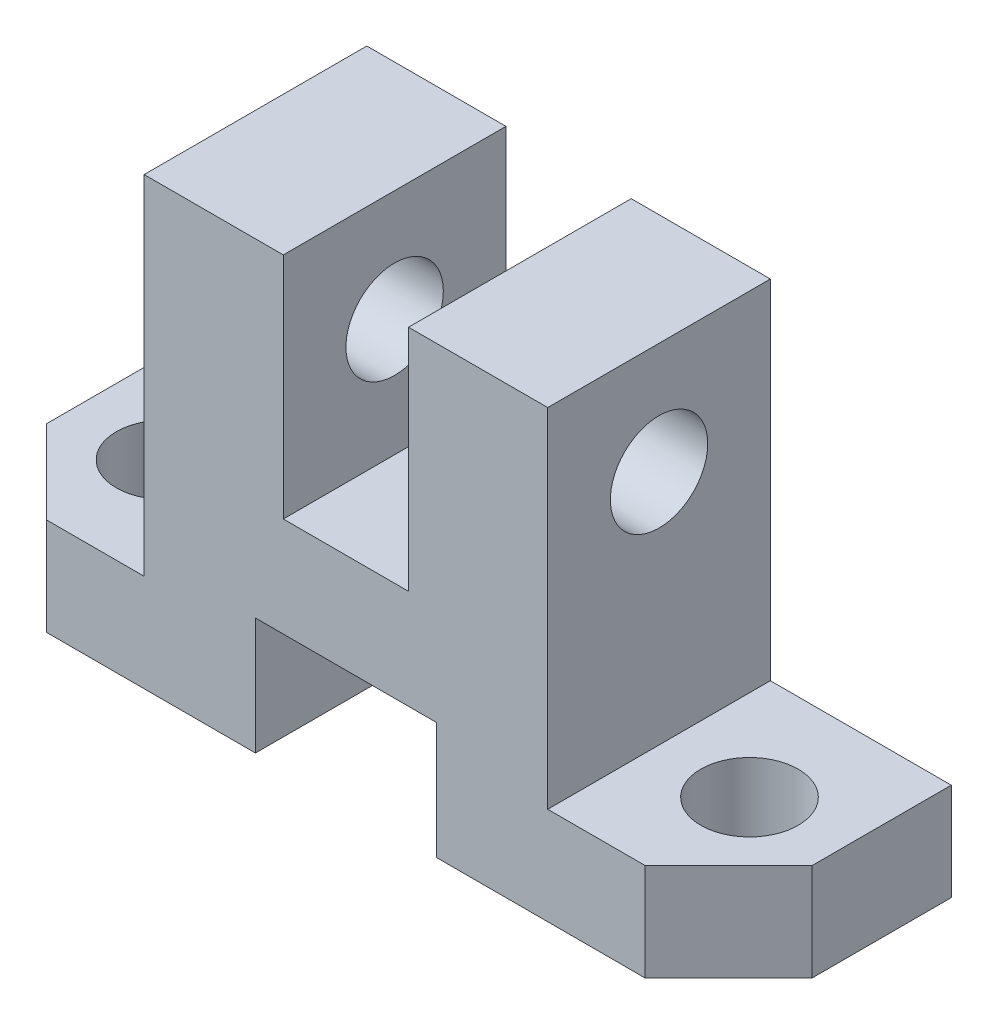
ISO-10303-21;
HEADER;
FILE_DESCRIPTION(('STEP AP214'),'2;1');
FILE_NAME('part.step','',(''),(''),'','','');
FILE_SCHEMA(('AUTOMOTIVE_DESIGN { 1 0 10303 214 1 1 1 1 }'));
ENDSEC;
DATA;
#1=APPLICATION_CONTEXT('core data for automotive mechanical design processes');
#2=APPLICATION_PROTOCOL_DEFINITION('international standard','automotive_design',2000,#1);
#3=PRODUCT_CONTEXT('',#1,'mechanical');
#4=PRODUCT('Part','Part','',(#3));
#5=PRODUCT_RELATED_PRODUCT_CATEGORY('part','',(#4));
#6=PRODUCT_DEFINITION_FORMATION('','',#4);
#7=PRODUCT_DEFINITION_CONTEXT('part definition',#1,'design');
#8=PRODUCT_DEFINITION('design','',#6,#7);
#9=PRODUCT_DEFINITION_SHAPE('','',#8);
#10=(LENGTH_UNIT() NAMED_UNIT(*) SI_UNIT(.MILLI.,.METRE.));
#11=(NAMED_UNIT(*) PLANE_ANGLE_UNIT() SI_UNIT($,.RADIAN.));
#12=(NAMED_UNIT(*) SI_UNIT($,.STERADIAN.) SOLID_ANGLE_UNIT());
#13=UNCERTAINTY_MEASURE_WITH_UNIT(LENGTH_MEASURE(1.E-05),#10,'distance_accuracy_value','');
#14=(GEOMETRIC_REPRESENTATION_CONTEXT(3) GLOBAL_UNCERTAINTY_ASSIGNED_CONTEXT((#13)) GLOBAL_UNIT_ASSIGNED_CONTEXT((#10,
#11,#12)) REPRESENTATION_CONTEXT('',''));
#15=CARTESIAN_POINT('',(0.,0.,0.));
#16=DIRECTION('',(0.,0.,1.));
#17=DIRECTION('',(1.,0.,0.));
#18=AXIS2_PLACEMENT_3D('',#15,#16,#17);
#19=CARTESIAN_POINT('',(-21.5,0.,8.));
#20=DIRECTION('',(0.707106781186547,0.,-0.707106781186548));
#21=DIRECTION('',(0.,-1.,0.));
#22=AXIS2_PLACEMENT_3D('',#19,#20,#21);
#23=PLANE('',#22);
#24=DIRECTION('',(0.,-1.,0.));
#25=VECTOR('',#24,1.);
#26=CARTESIAN_POINT('',(-21.5,0.,8.));
#27=LINE('',#26,#25);
#28=CARTESIAN_POINT('',(-21.5,-1.4046692607004,8.));
#29=VERTEX_POINT('',#28);
#30=CARTESIAN_POINT('',(-21.5,-8.40466926070039,8.));
#31=VERTEX_POINT('',#30);
#32=EDGE_CURVE('E203',#29,#31,#27,.T.);
#33=ORIENTED_EDGE('',*,*,#32,.F.);
#34=DIRECTION('',(-0.707106781186548,0.,-0.707106781186547));
#35=VECTOR('',#34,1.);
#36=CARTESIAN_POINT('',(-21.5,-1.4046692607004,8.));
#37=LINE('',#36,#35);
#38=CARTESIAN_POINT('',(-27.5,-1.4046692607004,2.));
#39=VERTEX_POINT('',#38);
#40=EDGE_CURVE('E47',#39,#29,#37,.F.);
#41=ORIENTED_EDGE('',*,*,#40,.F.);
#42=DIRECTION('',(0.,1.,0.));
#43=VECTOR('',#42,1.);
#44=CARTESIAN_POINT('',(-27.5,-1.4046692607004,2.));
#45=LINE('',#44,#43);
#46=CARTESIAN_POINT('',(-27.5,-8.4046692607004,2.));
#47=VERTEX_POINT('',#46);
#48=EDGE_CURVE('E205',#47,#39,#45,.T.);
#49=ORIENTED_EDGE('',*,*,#48,.F.);
#50=DIRECTION('',(0.707106781186548,0.,0.707106781186547));
#51=VECTOR('',#50,1.);
#52=CARTESIAN_POINT('',(-21.5,-8.40466926070039,8.));
#53=LINE('',#52,#51);
#54=EDGE_CURVE('E13',#31,#47,#53,.F.);
#55=ORIENTED_EDGE('',*,*,#54,.F.);
#56=EDGE_LOOP('',(#33,#41,#49,#55));
#57=FACE_BOUND('',#56,.T.);
#58=ADVANCED_FACE('F39',(#57),#23,.F.);
#59=CARTESIAN_POINT('',(27.5,-1.4046692607004,2.));
#60=DIRECTION('',(-0.707106781186547,0.,-0.707106781186547));
#61=DIRECTION('',(0.,-1.,0.));
#62=AXIS2_PLACEMENT_3D('',#59,#60,#61);
#63=PLANE('',#62);
#64=DIRECTION('',(0.,-1.,0.));
#65=VECTOR('',#64,1.);
#66=CARTESIAN_POINT('',(27.5,-1.4046692607004,2.));
#67=LINE('',#66,#65);
#68=CARTESIAN_POINT('',(27.5,-1.4046692607004,2.));
#69=VERTEX_POINT('',#68);
#70=CARTESIAN_POINT('',(27.5,-8.4046692607004,2.));
#71=VERTEX_POINT('',#70);
#72=EDGE_CURVE('E188',#69,#71,#67,.T.);
#73=ORIENTED_EDGE('',*,*,#72,.F.);
#74=DIRECTION('',(-0.707106781186548,0.,0.707106781186548));
#75=VECTOR('',#74,1.);
#76=CARTESIAN_POINT('',(27.5,-1.4046692607004,2.));
#77=LINE('',#76,#75);
#78=CARTESIAN_POINT('',(21.5,-1.4046692607004,8.));
#79=VERTEX_POINT('',#78);
#80=EDGE_CURVE('E199',#79,#69,#77,.F.);
#81=ORIENTED_EDGE('',*,*,#80,.F.);
#82=DIRECTION('',(0.,1.,0.));
#83=VECTOR('',#82,1.);
#84=CARTESIAN_POINT('',(21.5,0.,8.));
#85=LINE('',#84,#83);
#86=CARTESIAN_POINT('',(21.5,-8.40466926070039,8.));
#87=VERTEX_POINT('',#86);
#88=EDGE_CURVE('E191',#87,#79,#85,.T.);
#89=ORIENTED_EDGE('',*,*,#88,.F.);
#90=DIRECTION('',(0.707106781186548,0.,-0.707106781186548));
#91=VECTOR('',#90,1.);
#92=CARTESIAN_POINT('',(27.5,-8.4046692607004,2.));
#93=LINE('',#92,#91);
#94=EDGE_CURVE('E201',#71,#87,#93,.F.);
#95=ORIENTED_EDGE('',*,*,#94,.F.);
#96=EDGE_LOOP('',(#73,#81,#89,#95));
#97=FACE_BOUND('',#96,.T.);
#98=ADVANCED_FACE('F338',(#97),#63,.F.);
#99=CARTESIAN_POINT('',(-6.5,-8.40466926070039,8.));
#100=DIRECTION('',(-1.,0.,0.));
#101=DIRECTION('',(0.,-1.,0.));
#102=AXIS2_PLACEMENT_3D('',#99,#100,#101);
#103=PLANE('',#102);
#104=DIRECTION('',(0.,1.,0.));
#105=VECTOR('',#104,1.);
#106=CARTESIAN_POINT('',(-6.5,-8.40466926070039,-8.));
#107=LINE('',#106,#105);
#108=CARTESIAN_POINT('',(-6.5,-8.40466926070039,-8.));
#109=VERTEX_POINT('',#108);
#110=CARTESIAN_POINT('',(-6.5,0.,-8.));
#111=VERTEX_POINT('',#110);
#112=EDGE_CURVE('E187',#109,#111,#107,.T.);
#113=ORIENTED_EDGE('',*,*,#112,.T.);
#114=DIRECTION('',(0.,0.,-1.));
#115=VECTOR('',#114,1.);
#116=CARTESIAN_POINT('',(-6.5,0.,8.));
#117=LINE('',#116,#115);
#118=CARTESIAN_POINT('',(-6.5,0.,8.));
#119=VERTEX_POINT('',#118);
#120=EDGE_CURVE('E166',#119,#111,#117,.T.);
#121=ORIENTED_EDGE('',*,*,#120,.F.);
#122=DIRECTION('',(0.,1.,0.));
#123=VECTOR('',#122,1.);
#124=CARTESIAN_POINT('',(-6.5,-8.40466926070039,8.));
#125=LINE('',#124,#123);
#126=CARTESIAN_POINT('',(-6.5,-8.40466926070039,8.));
#127=VERTEX_POINT('',#126);
#128=EDGE_CURVE('E173',#127,#119,#125,.T.);
#129=ORIENTED_EDGE('',*,*,#128,.F.);
#130=DIRECTION('',(0.,0.,-1.));
#131=VECTOR('',#130,1.);
#132=CARTESIAN_POINT('',(-6.5,-8.40466926070039,8.));
#133=LINE('',#132,#131);
#134=EDGE_CURVE('E251',#127,#109,#133,.T.);
#135=ORIENTED_EDGE('',*,*,#134,.T.);
#136=EDGE_LOOP('',(#113,#121,#129,#135));
#137=FACE_BOUND('',#136,.T.);
#138=ADVANCED_FACE('F185',(#137),#103,.F.);
#139=CARTESIAN_POINT('',(-6.5,0.,8.));
#140=DIRECTION('',(0.,1.,0.));
#141=DIRECTION('',(0.,0.,1.));
#142=AXIS2_PLACEMENT_3D('',#139,#140,#141);
#143=PLANE('',#142);
#144=DIRECTION('',(1.,0.,0.));
#145=VECTOR('',#144,1.);
#146=CARTESIAN_POINT('',(-6.5,0.,-8.));
#147=LINE('',#146,#145);
#148=CARTESIAN_POINT('',(6.5,0.,-8.));
#149=VERTEX_POINT('',#148);
#150=EDGE_CURVE('E253',#111,#149,#147,.T.);
#151=ORIENTED_EDGE('',*,*,#150,.T.);
#152=DIRECTION('',(0.,0.,-1.));
#153=VECTOR('',#152,1.);
#154=CARTESIAN_POINT('',(6.5,0.,8.));
#155=LINE('',#154,#153);
#156=CARTESIAN_POINT('',(6.5,0.,8.));
#157=VERTEX_POINT('',#156);
#158=EDGE_CURVE('E169',#157,#149,#155,.T.);
#159=ORIENTED_EDGE('',*,*,#158,.F.);
#160=DIRECTION('',(1.,0.,0.));
#161=VECTOR('',#160,1.);
#162=CARTESIAN_POINT('',(-6.5,0.,8.));
#163=LINE('',#162,#161);
#164=EDGE_CURVE('E162',#119,#157,#163,.T.);
#165=ORIENTED_EDGE('',*,*,#164,.F.);
#166=ORIENTED_EDGE('',*,*,#120,.T.);
#167=EDGE_LOOP('',(#151,#159,#165,#166));
#168=FACE_BOUND('',#167,.T.);
#169=ADVANCED_FACE('F164',(#168),#143,.F.);
#170=CARTESIAN_POINT('',(6.5,0.,8.));
#171=DIRECTION('',(1.,0.,0.));
#172=DIRECTION('',(0.,1.,0.));
#173=AXIS2_PLACEMENT_3D('',#170,#171,#172);
#174=PLANE('',#173);
#175=DIRECTION('',(0.,-1.,0.));
#176=VECTOR('',#175,1.);
#177=CARTESIAN_POINT('',(6.5,0.,-8.));
#178=LINE('',#177,#176);
#179=CARTESIAN_POINT('',(6.5,-8.40466926070039,-8.));
#180=VERTEX_POINT('',#179);
#181=EDGE_CURVE('E255',#149,#180,#178,.T.);
#182=ORIENTED_EDGE('',*,*,#181,.T.);
#183=DIRECTION('',(0.,0.,-1.));
#184=VECTOR('',#183,1.);
#185=CARTESIAN_POINT('',(6.5,-8.40466926070039,8.));
#186=LINE('',#185,#184);
#187=CARTESIAN_POINT('',(6.5,-8.40466926070039,8.));
#188=VERTEX_POINT('',#187);
#189=EDGE_CURVE('E193',#188,#180,#186,.T.);
#190=ORIENTED_EDGE('',*,*,#189,.F.);
#191=DIRECTION('',(0.,-1.,0.));
#192=VECTOR('',#191,1.);
#193=CARTESIAN_POINT('',(6.5,0.,8.));
#194=LINE('',#193,#192);
#195=EDGE_CURVE('E172',#157,#188,#194,.T.);
#196=ORIENTED_EDGE('',*,*,#195,.F.);
#197=ORIENTED_EDGE('',*,*,#158,.T.);
#198=EDGE_LOOP('',(#182,#190,#196,#197));
#199=FACE_BOUND('',#198,.T.);
#200=ADVANCED_FACE('F340',(#199),#174,.F.);
#201=CARTESIAN_POINT('',(6.5,-8.40466926070039,8.));
#202=DIRECTION('',(0.,1.,0.));
#203=DIRECTION('',(-1.,0.,0.));
#204=AXIS2_PLACEMENT_3D('',#201,#202,#203);
#205=PLANE('',#204);
#206=CARTESIAN_POINT('',(21.,-8.40466926070039,0.));
#207=DIRECTION('',(0.,1.,0.));
#208=DIRECTION('',(-1.,0.,0.));
#209=AXIS2_PLACEMENT_3D('',#206,#207,#208);
#210=CIRCLE('',#209,3.5);
#211=CARTESIAN_POINT('',(17.5,-8.40466926070039,0.));
#212=VERTEX_POINT('',#211);
#213=EDGE_CURVE('E214',#212,#212,#210,.T.);
#214=ORIENTED_EDGE('',*,*,#213,.T.);
#215=EDGE_LOOP('',(#214));
#216=FACE_BOUND('',#215,.T.);
#217=DIRECTION('',(0.,0.,-1.));
#218=VECTOR('',#217,1.);
#219=CARTESIAN_POINT('',(27.5,-8.4046692607004,8.));
#220=LINE('',#219,#218);
#221=CARTESIAN_POINT('',(27.5,-8.4046692607004,-8.));
#222=VERTEX_POINT('',#221);
#223=EDGE_CURVE('E317',#71,#222,#220,.T.);
#224=ORIENTED_EDGE('',*,*,#223,.F.);
#225=ORIENTED_EDGE('',*,*,#94,.T.);
#226=DIRECTION('',(1.,0.,0.));
#227=VECTOR('',#226,1.);
#228=CARTESIAN_POINT('',(6.5,-8.40466926070039,8.));
#229=LINE('',#228,#227);
#230=EDGE_CURVE('E229',#188,#87,#229,.T.);
#231=ORIENTED_EDGE('',*,*,#230,.F.);
#232=ORIENTED_EDGE('',*,*,#189,.T.);
#233=DIRECTION('',(1.,0.,0.));
#234=VECTOR('',#233,1.);
#235=CARTESIAN_POINT('',(6.5,-8.40466926070039,-8.));
#236=LINE('',#235,#234);
#237=EDGE_CURVE('E257',#180,#222,#236,.T.);
#238=ORIENTED_EDGE('',*,*,#237,.T.);
#239=EDGE_LOOP('',(#224,#225,#231,#232,#238));
#240=FACE_BOUND('',#239,.T.);
#241=ADVANCED_FACE('F324',(#216,#240),#205,.F.);
#242=CARTESIAN_POINT('',(27.5,-1.4046692607004,8.));
#243=DIRECTION('',(-1.,0.,0.));
#244=DIRECTION('',(0.,-1.,0.));
#245=AXIS2_PLACEMENT_3D('',#242,#243,#244);
#246=PLANE('',#245);
#247=DIRECTION('',(0.,0.,-1.));
#248=VECTOR('',#247,1.);
#249=CARTESIAN_POINT('',(27.5,-1.4046692607004,8.));
#250=LINE('',#249,#248);
#251=CARTESIAN_POINT('',(27.5,-1.4046692607004,-8.));
#252=VERTEX_POINT('',#251);
#253=EDGE_CURVE('E315',#69,#252,#250,.T.);
#254=ORIENTED_EDGE('',*,*,#253,.F.);
#255=ORIENTED_EDGE('',*,*,#72,.T.);
#256=ORIENTED_EDGE('',*,*,#223,.T.);
#257=DIRECTION('',(0.,1.,0.));
#258=VECTOR('',#257,1.);
#259=CARTESIAN_POINT('',(27.5,-1.4046692607004,-8.));
#260=LINE('',#259,#258);
#261=EDGE_CURVE('E260',#222,#252,#260,.T.);
#262=ORIENTED_EDGE('',*,*,#261,.T.);
#263=EDGE_LOOP('',(#254,#255,#256,#262));
#264=FACE_BOUND('',#263,.T.);
#265=ADVANCED_FACE('F334',(#264),#246,.F.);
#266=CARTESIAN_POINT('',(27.5,-1.4046692607004,8.));
#267=DIRECTION('',(0.,-1.,0.));
#268=DIRECTION('',(1.,0.,0.));
#269=AXIS2_PLACEMENT_3D('',#266,#267,#268);
#270=PLANE('',#269);
#271=CARTESIAN_POINT('',(21.,-1.4046692607004,0.));
#272=DIRECTION('',(0.,1.,0.));
#273=DIRECTION('',(-1.,0.,0.));
#274=AXIS2_PLACEMENT_3D('',#271,#272,#273);
#275=CIRCLE('',#274,3.5);
#276=CARTESIAN_POINT('',(17.5,-1.4046692607004,0.));
#277=VERTEX_POINT('',#276);
#278=EDGE_CURVE('E209',#277,#277,#275,.T.);
#279=ORIENTED_EDGE('',*,*,#278,.F.);
#280=EDGE_LOOP('',(#279));
#281=FACE_BOUND('',#280,.T.);
#282=DIRECTION('',(-1.,0.,0.));
#283=VECTOR('',#282,1.);
#284=CARTESIAN_POINT('',(27.5,-1.4046692607004,8.));
#285=LINE('',#284,#283);
#286=CARTESIAN_POINT('',(14.5,-1.4046692607004,8.));
#287=VERTEX_POINT('',#286);
#288=EDGE_CURVE('E232',#79,#287,#285,.T.);
#289=ORIENTED_EDGE('',*,*,#288,.F.);
#290=ORIENTED_EDGE('',*,*,#80,.T.);
#291=ORIENTED_EDGE('',*,*,#253,.T.);
#292=DIRECTION('',(-1.,0.,0.));
#293=VECTOR('',#292,1.);
#294=CARTESIAN_POINT('',(27.5,-1.4046692607004,-8.));
#295=LINE('',#294,#293);
#296=CARTESIAN_POINT('',(14.5,-1.4046692607004,-8.));
#297=VERTEX_POINT('',#296);
#298=EDGE_CURVE('E263',#252,#297,#295,.T.);
#299=ORIENTED_EDGE('',*,*,#298,.T.);
#300=DIRECTION('',(0.,0.,-1.));
#301=VECTOR('',#300,1.);
#302=CARTESIAN_POINT('',(14.5,-1.4046692607004,8.));
#303=LINE('',#302,#301);
#304=EDGE_CURVE('E312',#287,#297,#303,.T.);
#305=ORIENTED_EDGE('',*,*,#304,.F.);
#306=EDGE_LOOP('',(#289,#290,#291,#299,#305));
#307=FACE_BOUND('',#306,.T.);
#308=ADVANCED_FACE('F402',(#281,#307),#270,.F.);
#309=CARTESIAN_POINT('',(14.5,-1.4046692607004,8.));
#310=DIRECTION('',(-1.,0.,0.));
#311=DIRECTION('',(0.,0.,1.));
#312=AXIS2_PLACEMENT_3D('',#309,#310,#311);
#313=PLANE('',#312);
#314=CARTESIAN_POINT('',(14.5,15.5953307392996,0.));
#315=DIRECTION('',(1.,0.,0.));
#316=DIRECTION('',(0.,0.,-1.));
#317=AXIS2_PLACEMENT_3D('',#314,#315,#316);
#318=CIRCLE('',#317,3.5);
#319=CARTESIAN_POINT('',(14.5,15.5953307392996,-3.5));
#320=VERTEX_POINT('',#319);
#321=EDGE_CURVE('E461',#320,#320,#318,.T.);
#322=ORIENTED_EDGE('',*,*,#321,.F.);
#323=EDGE_LOOP('',(#322));
#324=FACE_BOUND('',#323,.T.);
#325=DIRECTION('',(0.,1.,0.));
#326=VECTOR('',#325,1.);
#327=CARTESIAN_POINT('',(14.5,-1.4046692607004,-8.));
#328=LINE('',#327,#326);
#329=CARTESIAN_POINT('',(14.5,23.5953307392996,-8.));
#330=VERTEX_POINT('',#329);
#331=EDGE_CURVE('E265',#297,#330,#328,.T.);
#332=ORIENTED_EDGE('',*,*,#331,.T.);
#333=DIRECTION('',(0.,0.,-1.));
#334=VECTOR('',#333,1.);
#335=CARTESIAN_POINT('',(14.5,23.5953307392996,8.));
#336=LINE('',#335,#334);
#337=CARTESIAN_POINT('',(14.5,23.5953307392996,8.));
#338=VERTEX_POINT('',#337);
#339=EDGE_CURVE('E309',#338,#330,#336,.T.);
#340=ORIENTED_EDGE('',*,*,#339,.F.);
#341=DIRECTION('',(0.,1.,0.));
#342=VECTOR('',#341,1.);
#343=CARTESIAN_POINT('',(14.5,-1.4046692607004,8.));
#344=LINE('',#343,#342);
#345=EDGE_CURVE('E234',#287,#338,#344,.T.);
#346=ORIENTED_EDGE('',*,*,#345,.F.);
#347=ORIENTED_EDGE('',*,*,#304,.T.);
#348=EDGE_LOOP('',(#332,#340,#346,#347));
#349=FACE_BOUND('',#348,.T.);
#350=ADVANCED_FACE('F398',(#324,#349),#313,.F.);
#351=CARTESIAN_POINT('',(14.5,23.5953307392996,8.));
#352=DIRECTION('',(0.,-1.,0.));
#353=DIRECTION('',(1.,0.,0.));
#354=AXIS2_PLACEMENT_3D('',#351,#352,#353);
#355=PLANE('',#354);
#356=DIRECTION('',(-1.,0.,0.));
#357=VECTOR('',#356,1.);
#358=CARTESIAN_POINT('',(14.5,23.5953307392996,-8.));
#359=LINE('',#358,#357);
#360=CARTESIAN_POINT('',(4.5,23.5953307392996,-8.));
#361=VERTEX_POINT('',#360);
#362=EDGE_CURVE('E267',#330,#361,#359,.T.);
#363=ORIENTED_EDGE('',*,*,#362,.T.);
#364=DIRECTION('',(0.,0.,-1.));
#365=VECTOR('',#364,1.);
#366=CARTESIAN_POINT('',(4.5,23.5953307392996,8.));
#367=LINE('',#366,#365);
#368=CARTESIAN_POINT('',(4.5,23.5953307392996,8.));
#369=VERTEX_POINT('',#368);
#370=EDGE_CURVE('E306',#369,#361,#367,.T.);
#371=ORIENTED_EDGE('',*,*,#370,.F.);
#372=DIRECTION('',(-1.,0.,0.));
#373=VECTOR('',#372,1.);
#374=CARTESIAN_POINT('',(14.5,23.5953307392996,8.));
#375=LINE('',#374,#373);
#376=EDGE_CURVE('E236',#338,#369,#375,.T.);
#377=ORIENTED_EDGE('',*,*,#376,.F.);
#378=ORIENTED_EDGE('',*,*,#339,.T.);
#379=EDGE_LOOP('',(#363,#371,#377,#378));
#380=FACE_BOUND('',#379,.T.);
#381=ADVANCED_FACE('F395',(#380),#355,.F.);
#382=CARTESIAN_POINT('',(4.5,23.5953307392996,8.));
#383=DIRECTION('',(1.,0.,0.));
#384=DIRECTION('',(0.,1.,0.));
#385=AXIS2_PLACEMENT_3D('',#382,#383,#384);
#386=PLANE('',#385);
#387=CARTESIAN_POINT('',(4.5,15.5953307392996,0.));
#388=DIRECTION('',(1.,0.,0.));
#389=DIRECTION('',(0.,1.,0.));
#390=AXIS2_PLACEMENT_3D('',#387,#388,#389);
#391=CIRCLE('',#390,3.5);
#392=CARTESIAN_POINT('',(4.5,19.0953307392996,0.));
#393=VERTEX_POINT('',#392);
#394=EDGE_CURVE('E217',#393,#393,#391,.T.);
#395=ORIENTED_EDGE('',*,*,#394,.T.);
#396=EDGE_LOOP('',(#395));
#397=FACE_BOUND('',#396,.T.);
#398=DIRECTION('',(0.,-1.,0.));
#399=VECTOR('',#398,1.);
#400=CARTESIAN_POINT('',(4.5,23.5953307392996,-8.));
#401=LINE('',#400,#399);
#402=CARTESIAN_POINT('',(4.5,7.15953307392994,-8.));
#403=VERTEX_POINT('',#402);
#404=EDGE_CURVE('E269',#361,#403,#401,.T.);
#405=ORIENTED_EDGE('',*,*,#404,.T.);
#406=DIRECTION('',(0.,0.,-1.));
#407=VECTOR('',#406,1.);
#408=CARTESIAN_POINT('',(4.5,7.15953307392994,8.));
#409=LINE('',#408,#407);
#410=CARTESIAN_POINT('',(4.5,7.15953307392994,8.));
#411=VERTEX_POINT('',#410);
#412=EDGE_CURVE('E303',#411,#403,#409,.T.);
#413=ORIENTED_EDGE('',*,*,#412,.F.);
#414=DIRECTION('',(0.,-1.,0.));
#415=VECTOR('',#414,1.);
#416=CARTESIAN_POINT('',(4.5,23.5953307392996,8.));
#417=LINE('',#416,#415);
#418=EDGE_CURVE('E238',#369,#411,#417,.T.);
#419=ORIENTED_EDGE('',*,*,#418,.F.);
#420=ORIENTED_EDGE('',*,*,#370,.T.);
#421=EDGE_LOOP('',(#405,#413,#419,#420));
#422=FACE_BOUND('',#421,.T.);
#423=ADVANCED_FACE('F391',(#397,#422),#386,.F.);
#424=CARTESIAN_POINT('',(4.5,7.15953307392994,8.));
#425=DIRECTION('',(0.,-1.,0.));
#426=DIRECTION('',(0.,0.,-1.));
#427=AXIS2_PLACEMENT_3D('',#424,#425,#426);
#428=PLANE('',#427);
#429=DIRECTION('',(-1.,0.,0.));
#430=VECTOR('',#429,1.);
#431=CARTESIAN_POINT('',(4.5,7.15953307392994,-8.));
#432=LINE('',#431,#430);
#433=CARTESIAN_POINT('',(-4.5,7.15953307392994,-8.));
#434=VERTEX_POINT('',#433);
#435=EDGE_CURVE('E271',#403,#434,#432,.T.);
#436=ORIENTED_EDGE('',*,*,#435,.T.);
#437=DIRECTION('',(0.,0.,-1.));
#438=VECTOR('',#437,1.);
#439=CARTESIAN_POINT('',(-4.5,7.15953307392994,8.));
#440=LINE('',#439,#438);
#441=CARTESIAN_POINT('',(-4.5,7.15953307392994,8.));
#442=VERTEX_POINT('',#441);
#443=EDGE_CURVE('E300',#442,#434,#440,.T.);
#444=ORIENTED_EDGE('',*,*,#443,.F.);
#445=DIRECTION('',(-1.,0.,0.));
#446=VECTOR('',#445,1.);
#447=CARTESIAN_POINT('',(4.5,7.15953307392994,8.));
#448=LINE('',#447,#446);
#449=EDGE_CURVE('E240',#411,#442,#448,.T.);
#450=ORIENTED_EDGE('',*,*,#449,.F.);
#451=ORIENTED_EDGE('',*,*,#412,.T.);
#452=EDGE_LOOP('',(#436,#444,#450,#451));
#453=FACE_BOUND('',#452,.T.);
#454=ADVANCED_FACE('F386',(#453),#428,.F.);
#455=CARTESIAN_POINT('',(-4.5,7.15953307392994,8.));
#456=DIRECTION('',(-1.,0.,0.));
#457=DIRECTION('',(0.,-1.,0.));
#458=AXIS2_PLACEMENT_3D('',#455,#456,#457);
#459=PLANE('',#458);
#460=CARTESIAN_POINT('',(-4.5,15.5953307392996,0.));
#461=DIRECTION('',(-1.,0.,0.));
#462=DIRECTION('',(0.,-1.,0.));
#463=AXIS2_PLACEMENT_3D('',#460,#461,#462);
#464=CIRCLE('',#463,3.5);
#465=CARTESIAN_POINT('',(-4.5,12.0953307392996,0.));
#466=VERTEX_POINT('',#465);
#467=EDGE_CURVE('E222',#466,#466,#464,.T.);
#468=ORIENTED_EDGE('',*,*,#467,.T.);
#469=EDGE_LOOP('',(#468));
#470=FACE_BOUND('',#469,.T.);
#471=DIRECTION('',(0.,1.,0.));
#472=VECTOR('',#471,1.);
#473=CARTESIAN_POINT('',(-4.5,7.15953307392994,-8.));
#474=LINE('',#473,#472);
#475=CARTESIAN_POINT('',(-4.5,23.5953307392996,-8.));
#476=VERTEX_POINT('',#475);
#477=EDGE_CURVE('E273',#434,#476,#474,.T.);
#478=ORIENTED_EDGE('',*,*,#477,.T.);
#479=DIRECTION('',(0.,0.,-1.));
#480=VECTOR('',#479,1.);
#481=CARTESIAN_POINT('',(-4.5,23.5953307392996,8.));
#482=LINE('',#481,#480);
#483=CARTESIAN_POINT('',(-4.5,23.5953307392996,8.));
#484=VERTEX_POINT('',#483);
#485=EDGE_CURVE('E297',#484,#476,#482,.T.);
#486=ORIENTED_EDGE('',*,*,#485,.F.);
#487=DIRECTION('',(0.,1.,0.));
#488=VECTOR('',#487,1.);
#489=CARTESIAN_POINT('',(-4.5,7.15953307392994,8.));
#490=LINE('',#489,#488);
#491=EDGE_CURVE('E242',#442,#484,#490,.T.);
#492=ORIENTED_EDGE('',*,*,#491,.F.);
#493=ORIENTED_EDGE('',*,*,#443,.T.);
#494=EDGE_LOOP('',(#478,#486,#492,#493));
#495=FACE_BOUND('',#494,.T.);
#496=ADVANCED_FACE('F380',(#470,#495),#459,.F.);
#497=CARTESIAN_POINT('',(-4.5,23.5953307392996,8.));
#498=DIRECTION('',(0.,-1.,0.));
#499=DIRECTION('',(1.,0.,0.));
#500=AXIS2_PLACEMENT_3D('',#497,#498,#499);
#501=PLANE('',#500);
#502=DIRECTION('',(-1.,0.,0.));
#503=VECTOR('',#502,1.);
#504=CARTESIAN_POINT('',(-4.5,23.5953307392996,-8.));
#505=LINE('',#504,#503);
#506=CARTESIAN_POINT('',(-14.5,23.5953307392996,-8.));
#507=VERTEX_POINT('',#506);
#508=EDGE_CURVE('E275',#476,#507,#505,.T.);
#509=ORIENTED_EDGE('',*,*,#508,.T.);
#510=DIRECTION('',(0.,0.,-1.));
#511=VECTOR('',#510,1.);
#512=CARTESIAN_POINT('',(-14.5,23.5953307392996,8.));
#513=LINE('',#512,#511);
#514=CARTESIAN_POINT('',(-14.5,23.5953307392996,8.));
#515=VERTEX_POINT('',#514);
#516=EDGE_CURVE('E294',#515,#507,#513,.T.);
#517=ORIENTED_EDGE('',*,*,#516,.F.);
#518=DIRECTION('',(-1.,0.,0.));
#519=VECTOR('',#518,1.);
#520=CARTESIAN_POINT('',(-4.5,23.5953307392996,8.));
#521=LINE('',#520,#519);
#522=EDGE_CURVE('E244',#484,#515,#521,.T.);
#523=ORIENTED_EDGE('',*,*,#522,.F.);
#524=ORIENTED_EDGE('',*,*,#485,.T.);
#525=EDGE_LOOP('',(#509,#517,#523,#524));
#526=FACE_BOUND('',#525,.T.);
#527=ADVANCED_FACE('F376',(#526),#501,.F.);
#528=CARTESIAN_POINT('',(-14.5,23.5953307392996,8.));
#529=DIRECTION('',(1.,0.,0.));
#530=DIRECTION('',(0.,0.,-1.));
#531=AXIS2_PLACEMENT_3D('',#528,#529,#530);
#532=PLANE('',#531);
#533=CARTESIAN_POINT('',(-14.5,15.5953307392996,0.));
#534=DIRECTION('',(1.,0.,0.));
#535=DIRECTION('',(0.,0.,-1.));
#536=AXIS2_PLACEMENT_3D('',#533,#534,#535);
#537=CIRCLE('',#536,3.5);
#538=CARTESIAN_POINT('',(-14.5,15.5953307392996,-3.5));
#539=VERTEX_POINT('',#538);
#540=EDGE_CURVE('E42',#539,#539,#537,.T.);
#541=ORIENTED_EDGE('',*,*,#540,.T.);
#542=EDGE_LOOP('',(#541));
#543=FACE_BOUND('',#542,.T.);
#544=DIRECTION('',(0.,-1.,0.));
#545=VECTOR('',#544,1.);
#546=CARTESIAN_POINT('',(-14.5,23.5953307392996,-8.));
#547=LINE('',#546,#545);
#548=CARTESIAN_POINT('',(-14.5,-1.4046692607004,-8.));
#549=VERTEX_POINT('',#548);
#550=EDGE_CURVE('E277',#507,#549,#547,.T.);
#551=ORIENTED_EDGE('',*,*,#550,.T.);
#552=DIRECTION('',(0.,0.,-1.));
#553=VECTOR('',#552,1.);
#554=CARTESIAN_POINT('',(-14.5,-1.4046692607004,8.));
#555=LINE('',#554,#553);
#556=CARTESIAN_POINT('',(-14.5,-1.4046692607004,8.));
#557=VERTEX_POINT('',#556);
#558=EDGE_CURVE('E291',#557,#549,#555,.T.);
#559=ORIENTED_EDGE('',*,*,#558,.F.);
#560=DIRECTION('',(0.,-1.,0.));
#561=VECTOR('',#560,1.);
#562=CARTESIAN_POINT('',(-14.5,23.5953307392996,8.));
#563=LINE('',#562,#561);
#564=EDGE_CURVE('E246',#515,#557,#563,.T.);
#565=ORIENTED_EDGE('',*,*,#564,.F.);
#566=ORIENTED_EDGE('',*,*,#516,.T.);
#567=EDGE_LOOP('',(#551,#559,#565,#566));
#568=FACE_BOUND('',#567,.T.);
#569=ADVANCED_FACE('F372',(#543,#568),#532,.F.);
#570=CARTESIAN_POINT('',(-14.5,-1.4046692607004,8.));
#571=DIRECTION('',(0.,-1.,0.));
#572=DIRECTION('',(1.,0.,0.));
#573=AXIS2_PLACEMENT_3D('',#570,#571,#572);
#574=PLANE('',#573);
#575=CARTESIAN_POINT('',(-21.,-1.4046692607004,0.));
#576=DIRECTION('',(0.,-1.,0.));
#577=DIRECTION('',(1.,0.,0.));
#578=AXIS2_PLACEMENT_3D('',#575,#576,#577);
#579=CIRCLE('',#578,3.5);
#580=CARTESIAN_POINT('',(-17.5,-1.4046692607004,0.));
#581=VERTEX_POINT('',#580);
#582=EDGE_CURVE('E210',#581,#581,#579,.T.);
#583=ORIENTED_EDGE('',*,*,#582,.T.);
#584=EDGE_LOOP('',(#583));
#585=FACE_BOUND('',#584,.T.);
#586=DIRECTION('',(0.,0.,-1.));
#587=VECTOR('',#586,1.);
#588=CARTESIAN_POINT('',(-27.5,-1.4046692607004,8.));
#589=LINE('',#588,#587);
#590=CARTESIAN_POINT('',(-27.5,-1.4046692607004,-8.));
#591=VERTEX_POINT('',#590);
#592=EDGE_CURVE('E289',#39,#591,#589,.T.);
#593=ORIENTED_EDGE('',*,*,#592,.F.);
#594=ORIENTED_EDGE('',*,*,#40,.T.);
#595=DIRECTION('',(-1.,0.,0.));
#596=VECTOR('',#595,1.);
#597=CARTESIAN_POINT('',(-14.5,-1.4046692607004,8.));
#598=LINE('',#597,#596);
#599=EDGE_CURVE('E248',#557,#29,#598,.T.);
#600=ORIENTED_EDGE('',*,*,#599,.F.);
#601=ORIENTED_EDGE('',*,*,#558,.T.);
#602=DIRECTION('',(-1.,0.,0.));
#603=VECTOR('',#602,1.);
#604=CARTESIAN_POINT('',(-14.5,-1.4046692607004,-8.));
#605=LINE('',#604,#603);
#606=EDGE_CURVE('E279',#549,#591,#605,.T.);
#607=ORIENTED_EDGE('',*,*,#606,.T.);
#608=EDGE_LOOP('',(#593,#594,#600,#601,#607));
#609=FACE_BOUND('',#608,.T.);
#610=ADVANCED_FACE('F360',(#585,#609),#574,.F.);
#611=CARTESIAN_POINT('',(-27.5,-1.4046692607004,8.));
#612=DIRECTION('',(1.,0.,0.));
#613=DIRECTION('',(0.,1.,0.));
#614=AXIS2_PLACEMENT_3D('',#611,#612,#613);
#615=PLANE('',#614);
#616=DIRECTION('',(0.,0.,-1.));
#617=VECTOR('',#616,1.);
#618=CARTESIAN_POINT('',(-27.5,-8.4046692607004,8.));
#619=LINE('',#618,#617);
#620=CARTESIAN_POINT('',(-27.5,-8.4046692607004,-8.));
#621=VERTEX_POINT('',#620);
#622=EDGE_CURVE('E287',#47,#621,#619,.T.);
#623=ORIENTED_EDGE('',*,*,#622,.F.);
#624=ORIENTED_EDGE('',*,*,#48,.T.);
#625=ORIENTED_EDGE('',*,*,#592,.T.);
#626=DIRECTION('',(0.,-1.,0.));
#627=VECTOR('',#626,1.);
#628=CARTESIAN_POINT('',(-27.5,-1.4046692607004,-8.));
#629=LINE('',#628,#627);
#630=EDGE_CURVE('E282',#591,#621,#629,.T.);
#631=ORIENTED_EDGE('',*,*,#630,.T.);
#632=EDGE_LOOP('',(#623,#624,#625,#631));
#633=FACE_BOUND('',#632,.T.);
#634=ADVANCED_FACE('F365',(#633),#615,.F.);
#635=CARTESIAN_POINT('',(-27.5,-8.4046692607004,8.));
#636=DIRECTION('',(0.,1.,0.));
#637=DIRECTION('',(-1.,0.,0.));
#638=AXIS2_PLACEMENT_3D('',#635,#636,#637);
#639=PLANE('',#638);
#640=CARTESIAN_POINT('',(-21.,-8.40466926070039,0.));
#641=DIRECTION('',(0.,1.,0.));
#642=DIRECTION('',(-1.,0.,0.));
#643=AXIS2_PLACEMENT_3D('',#640,#641,#642);
#644=CIRCLE('',#643,3.5);
#645=CARTESIAN_POINT('',(-24.5,-8.4046692607004,0.));
#646=VERTEX_POINT('',#645);
#647=EDGE_CURVE('E207',#646,#646,#644,.F.);
#648=ORIENTED_EDGE('',*,*,#647,.F.);
#649=EDGE_LOOP('',(#648));
#650=FACE_BOUND('',#649,.T.);
#651=DIRECTION('',(1.,0.,0.));
#652=VECTOR('',#651,1.);
#653=CARTESIAN_POINT('',(-27.5,-8.4046692607004,8.));
#654=LINE('',#653,#652);
#655=EDGE_CURVE('E179',#31,#127,#654,.T.);
#656=ORIENTED_EDGE('',*,*,#655,.F.);
#657=ORIENTED_EDGE('',*,*,#54,.T.);
#658=ORIENTED_EDGE('',*,*,#622,.T.);
#659=DIRECTION('',(1.,0.,0.));
#660=VECTOR('',#659,1.);
#661=CARTESIAN_POINT('',(-27.5,-8.4046692607004,-8.));
#662=LINE('',#661,#660);
#663=EDGE_CURVE('E183',#621,#109,#662,.T.);
#664=ORIENTED_EDGE('',*,*,#663,.T.);
#665=ORIENTED_EDGE('',*,*,#134,.F.);
#666=EDGE_LOOP('',(#656,#657,#658,#664,#665));
#667=FACE_BOUND('',#666,.T.);
#668=ADVANCED_FACE('F367',(#650,#667),#639,.F.);
#669=CARTESIAN_POINT('',(0.,0.,8.));
#670=DIRECTION('',(0.,0.,-1.));
#671=DIRECTION('',(-1.,0.,0.));
#672=AXIS2_PLACEMENT_3D('',#669,#670,#671);
#673=PLANE('',#672);
#674=ORIENTED_EDGE('',*,*,#599,.T.);
#675=ORIENTED_EDGE('',*,*,#32,.T.);
#676=ORIENTED_EDGE('',*,*,#655,.T.);
#677=ORIENTED_EDGE('',*,*,#128,.T.);
#678=ORIENTED_EDGE('',*,*,#164,.T.);
#679=ORIENTED_EDGE('',*,*,#195,.T.);
#680=ORIENTED_EDGE('',*,*,#230,.T.);
#681=ORIENTED_EDGE('',*,*,#88,.T.);
#682=ORIENTED_EDGE('',*,*,#288,.T.);
#683=ORIENTED_EDGE('',*,*,#345,.T.);
#684=ORIENTED_EDGE('',*,*,#376,.T.);
#685=ORIENTED_EDGE('',*,*,#418,.T.);
#686=ORIENTED_EDGE('',*,*,#449,.T.);
#687=ORIENTED_EDGE('',*,*,#491,.T.);
#688=ORIENTED_EDGE('',*,*,#522,.T.);
#689=ORIENTED_EDGE('',*,*,#564,.T.);
#690=EDGE_LOOP('',(#674,#675,#676,#677,#678,#679,#680,#681,#682,#683,#684,#685,#686,#687,#688,#689));
#691=FACE_BOUND('',#690,.T.);
#692=ADVANCED_FACE('F177',(#691),#673,.F.);
#693=CARTESIAN_POINT('',(0.,0.,-8.));
#694=DIRECTION('',(0.,0.,-1.));
#695=DIRECTION('',(-1.,0.,0.));
#696=AXIS2_PLACEMENT_3D('',#693,#694,#695);
#697=PLANE('',#696);
#698=ORIENTED_EDGE('',*,*,#112,.F.);
#699=ORIENTED_EDGE('',*,*,#663,.F.);
#700=ORIENTED_EDGE('',*,*,#630,.F.);
#701=ORIENTED_EDGE('',*,*,#606,.F.);
#702=ORIENTED_EDGE('',*,*,#550,.F.);
#703=ORIENTED_EDGE('',*,*,#508,.F.);
#704=ORIENTED_EDGE('',*,*,#477,.F.);
#705=ORIENTED_EDGE('',*,*,#435,.F.);
#706=ORIENTED_EDGE('',*,*,#404,.F.);
#707=ORIENTED_EDGE('',*,*,#362,.F.);
#708=ORIENTED_EDGE('',*,*,#331,.F.);
#709=ORIENTED_EDGE('',*,*,#298,.F.);
#710=ORIENTED_EDGE('',*,*,#261,.F.);
#711=ORIENTED_EDGE('',*,*,#237,.F.);
#712=ORIENTED_EDGE('',*,*,#181,.F.);
#713=ORIENTED_EDGE('',*,*,#150,.F.);
#714=EDGE_LOOP('',(#698,#699,#700,#701,#702,#703,#704,#705,#706,#707,#708,#709,#710,#711,#712,#713));
#715=FACE_BOUND('',#714,.T.);
#716=ADVANCED_FACE('F329',(#715),#697,.T.);
#717=CARTESIAN_POINT('',(21.,-17.4046692607004,0.));
#718=DIRECTION('',(0.,1.,0.));
#719=DIRECTION('',(-1.,0.,0.));
#720=AXIS2_PLACEMENT_3D('',#717,#718,#719);
#721=CYLINDRICAL_SURFACE('',#720,3.5);
#722=ORIENTED_EDGE('',*,*,#278,.T.);
#723=EDGE_LOOP('',(#722));
#724=FACE_BOUND('',#723,.T.);
#725=ORIENTED_EDGE('',*,*,#213,.F.);
#726=EDGE_LOOP('',(#725));
#727=FACE_BOUND('',#726,.T.);
#728=ADVANCED_FACE('F440',(#724,#727),#721,.F.);
#729=CARTESIAN_POINT('',(-21.,-17.4046692607004,0.));
#730=DIRECTION('',(0.,1.,0.));
#731=DIRECTION('',(-1.,0.,0.));
#732=AXIS2_PLACEMENT_3D('',#729,#730,#731);
#733=CYLINDRICAL_SURFACE('',#732,3.5);
#734=ORIENTED_EDGE('',*,*,#582,.F.);
#735=EDGE_LOOP('',(#734));
#736=FACE_BOUND('',#735,.T.);
#737=ORIENTED_EDGE('',*,*,#647,.T.);
#738=EDGE_LOOP('',(#737));
#739=FACE_BOUND('',#738,.T.);
#740=ADVANCED_FACE('F445',(#736,#739),#733,.F.);
#741=CARTESIAN_POINT('',(-27.5,15.5953307392996,0.));
#742=DIRECTION('',(1.,0.,0.));
#743=DIRECTION('',(0.,0.,-1.));
#744=AXIS2_PLACEMENT_3D('',#741,#742,#743);
#745=CYLINDRICAL_SURFACE('',#744,3.5);
#746=ORIENTED_EDGE('',*,*,#540,.F.);
#747=EDGE_LOOP('',(#746));
#748=FACE_BOUND('',#747,.T.);
#749=ORIENTED_EDGE('',*,*,#467,.F.);
#750=EDGE_LOOP('',(#749));
#751=FACE_BOUND('',#750,.T.);
#752=ADVANCED_FACE('F449',(#748,#751),#745,.F.);
#753=ORIENTED_EDGE('',*,*,#321,.T.);
#754=EDGE_LOOP('',(#753));
#755=FACE_BOUND('',#754,.T.);
#756=ORIENTED_EDGE('',*,*,#394,.F.);
#757=EDGE_LOOP('',(#756));
#758=FACE_BOUND('',#757,.T.);
#759=ADVANCED_FACE('F451',(#755,#758),#745,.F.);
#760=CLOSED_SHELL('',(#58,#98,#138,#169,#200,#241,#265,#308,#350,#381,#423,#454,#496,#527,#569,
#610,#634,#668,#692,#716,#728,#740,#752,#759));
#761=MANIFOLD_SOLID_BREP('B2',#760);
#762=ADVANCED_BREP_SHAPE_REPRESENTATION('',(#18,#761),#14);
#763=SHAPE_DEFINITION_REPRESENTATION(#9,#762);
ENDSEC;
END-ISO-10303-21;
